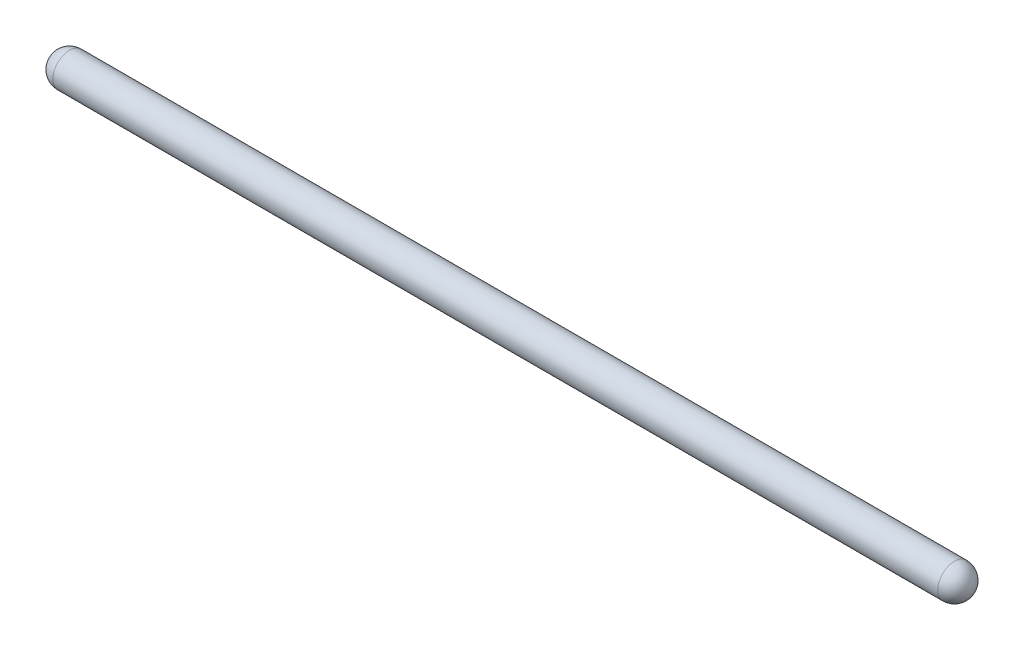
ISO-10303-21;
HEADER;
FILE_DESCRIPTION(('STEP AP214'),'2;1');
FILE_NAME('part.step','',(''),(''),'','','');
FILE_SCHEMA(('AUTOMOTIVE_DESIGN { 1 0 10303 214 1 1 1 1 }'));
ENDSEC;
DATA;
#1=APPLICATION_CONTEXT('core data for automotive mechanical design processes');
#2=APPLICATION_PROTOCOL_DEFINITION('international standard','automotive_design',2000,#1);
#3=PRODUCT_CONTEXT('',#1,'mechanical');
#4=PRODUCT('Part','Part','',(#3));
#5=PRODUCT_RELATED_PRODUCT_CATEGORY('part','',(#4));
#6=PRODUCT_DEFINITION_FORMATION('','',#4);
#7=PRODUCT_DEFINITION_CONTEXT('part definition',#1,'design');
#8=PRODUCT_DEFINITION('design','',#6,#7);
#9=PRODUCT_DEFINITION_SHAPE('','',#8);
#10=(LENGTH_UNIT() NAMED_UNIT(*) SI_UNIT(.MILLI.,.METRE.));
#11=(NAMED_UNIT(*) PLANE_ANGLE_UNIT() SI_UNIT($,.RADIAN.));
#12=(NAMED_UNIT(*) SI_UNIT($,.STERADIAN.) SOLID_ANGLE_UNIT());
#13=UNCERTAINTY_MEASURE_WITH_UNIT(LENGTH_MEASURE(1.E-05),#10,'distance_accuracy_value','');
#14=(GEOMETRIC_REPRESENTATION_CONTEXT(3) GLOBAL_UNCERTAINTY_ASSIGNED_CONTEXT((#13)) GLOBAL_UNIT_ASSIGNED_CONTEXT((#10,
#11,#12)) REPRESENTATION_CONTEXT('',''));
#15=CARTESIAN_POINT('',(0.,0.,0.));
#16=DIRECTION('',(0.,0.,1.));
#17=DIRECTION('',(1.,0.,0.));
#18=AXIS2_PLACEMENT_3D('',#15,#16,#17);
#19=CARTESIAN_POINT('',(3.,0.,0.));
#20=DIRECTION('',(-1.,0.,0.));
#21=DIRECTION('',(0.,1.,0.));
#22=AXIS2_PLACEMENT_3D('',#19,#20,#21);
#23=SPHERICAL_SURFACE('',#22,3.);
#24=CARTESIAN_POINT('',(3.,0.,0.));
#25=DIRECTION('',(-1.,0.,0.));
#26=DIRECTION('',(0.,0.,1.));
#27=AXIS2_PLACEMENT_3D('',#24,#25,#26);
#28=CIRCLE('',#27,3.);
#29=CARTESIAN_POINT('',(3.,0.,3.));
#30=VERTEX_POINT('',#29);
#31=EDGE_CURVE('E43',#30,#30,#28,.T.);
#32=ORIENTED_EDGE('',*,*,#31,.T.);
#33=EDGE_LOOP('',(#32));
#34=FACE_BOUND('',#33,.T.);
#35=ADVANCED_FACE('F40',(#34),#23,.T.);
#36=CARTESIAN_POINT('',(162.,0.,0.));
#37=DIRECTION('',(-1.,0.,0.));
#38=DIRECTION('',(0.,1.,0.));
#39=AXIS2_PLACEMENT_3D('',#36,#37,#38);
#40=SPHERICAL_SURFACE('',#39,3.);
#41=CARTESIAN_POINT('',(162.,0.,0.));
#42=DIRECTION('',(-1.,0.,0.));
#43=DIRECTION('',(0.,0.,1.));
#44=AXIS2_PLACEMENT_3D('',#41,#42,#43);
#45=CIRCLE('',#44,3.);
#46=CARTESIAN_POINT('',(162.,0.,3.));
#47=VERTEX_POINT('',#46);
#48=EDGE_CURVE('E10',#47,#47,#45,.T.);
#49=ORIENTED_EDGE('',*,*,#48,.F.);
#50=EDGE_LOOP('',(#49));
#51=FACE_BOUND('',#50,.T.);
#52=ADVANCED_FACE('F55',(#51),#40,.T.);
#53=CARTESIAN_POINT('',(0.,0.,0.));
#54=DIRECTION('',(-1.,0.,0.));
#55=DIRECTION('',(0.,0.,1.));
#56=AXIS2_PLACEMENT_3D('',#53,#54,#55);
#57=CYLINDRICAL_SURFACE('',#56,3.);
#58=ORIENTED_EDGE('',*,*,#31,.F.);
#59=EDGE_LOOP('',(#58));
#60=FACE_BOUND('',#59,.T.);
#61=ORIENTED_EDGE('',*,*,#48,.T.);
#62=EDGE_LOOP('',(#61));
#63=FACE_BOUND('',#62,.T.);
#64=ADVANCED_FACE('F49',(#60,#63),#57,.T.);
#65=CLOSED_SHELL('',(#35,#52,#64));
#66=MANIFOLD_SOLID_BREP('B2',#65);
#67=ADVANCED_BREP_SHAPE_REPRESENTATION('',(#18,#66),#14);
#68=SHAPE_DEFINITION_REPRESENTATION(#9,#67);
ENDSEC;
END-ISO-10303-21;
